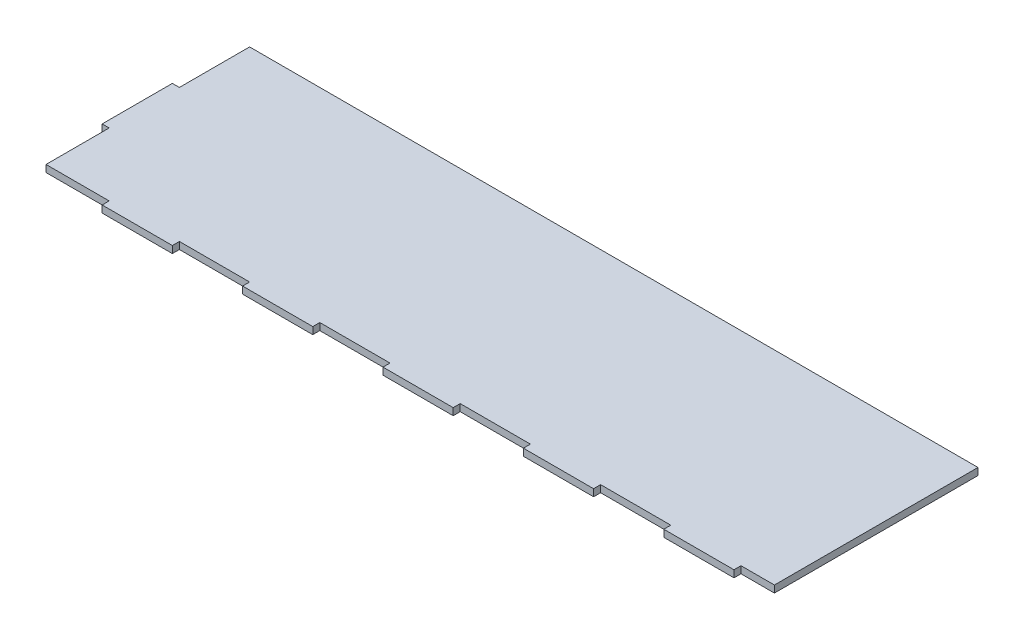
ISO-10303-21;
HEADER;
FILE_DESCRIPTION(('STEP AP214'),'2;1');
FILE_NAME('part.step','',(''),(''),'','','');
FILE_SCHEMA(('AUTOMOTIVE_DESIGN { 1 0 10303 214 1 1 1 1 }'));
ENDSEC;
DATA;
#1=APPLICATION_CONTEXT('core data for automotive mechanical design processes');
#2=APPLICATION_PROTOCOL_DEFINITION('international standard','automotive_design',2000,#1);
#3=PRODUCT_CONTEXT('',#1,'mechanical');
#4=PRODUCT('Part','Part','',(#3));
#5=PRODUCT_RELATED_PRODUCT_CATEGORY('part','',(#4));
#6=PRODUCT_DEFINITION_FORMATION('','',#4);
#7=PRODUCT_DEFINITION_CONTEXT('part definition',#1,'design');
#8=PRODUCT_DEFINITION('design','',#6,#7);
#9=PRODUCT_DEFINITION_SHAPE('','',#8);
#10=(LENGTH_UNIT() NAMED_UNIT(*) SI_UNIT(.MILLI.,.METRE.));
#11=(NAMED_UNIT(*) PLANE_ANGLE_UNIT() SI_UNIT($,.RADIAN.));
#12=(NAMED_UNIT(*) SI_UNIT($,.STERADIAN.) SOLID_ANGLE_UNIT());
#13=UNCERTAINTY_MEASURE_WITH_UNIT(LENGTH_MEASURE(1.E-05),#10,'distance_accuracy_value','');
#14=(GEOMETRIC_REPRESENTATION_CONTEXT(3) GLOBAL_UNCERTAINTY_ASSIGNED_CONTEXT((#13)) GLOBAL_UNIT_ASSIGNED_CONTEXT((#10,
#11,#12)) REPRESENTATION_CONTEXT('',''));
#15=CARTESIAN_POINT('',(0.,0.,0.));
#16=DIRECTION('',(0.,0.,1.));
#17=DIRECTION('',(1.,0.,0.));
#18=AXIS2_PLACEMENT_3D('',#15,#16,#17);
#19=CARTESIAN_POINT('',(-0.725000000000031,0.,0.));
#20=DIRECTION('',(1.,0.,0.));
#21=DIRECTION('',(0.,0.,-1.));
#22=AXIS2_PLACEMENT_3D('',#19,#20,#21);
#23=PLANE('',#22);
#24=DIRECTION('',(0.,0.,1.));
#25=VECTOR('',#24,1.);
#26=CARTESIAN_POINT('',(-0.725000000000031,0.,0.));
#27=LINE('',#26,#25);
#28=CARTESIAN_POINT('',(-0.725000000000031,0.,-45.));
#29=VERTEX_POINT('',#28);
#30=CARTESIAN_POINT('',(-0.725000000000031,0.,42.));
#31=VERTEX_POINT('',#30);
#32=EDGE_CURVE('E241',#29,#31,#27,.T.);
#33=ORIENTED_EDGE('',*,*,#32,.F.);
#34=DIRECTION('',(0.,1.,0.));
#35=VECTOR('',#34,1.);
#36=CARTESIAN_POINT('',(-0.725000000000031,3.,-45.));
#37=LINE('',#36,#35);
#38=CARTESIAN_POINT('',(-0.725000000000031,3.,-45.));
#39=VERTEX_POINT('',#38);
#40=EDGE_CURVE('E65',#29,#39,#37,.T.);
#41=ORIENTED_EDGE('',*,*,#40,.T.);
#42=DIRECTION('',(0.,0.,1.));
#43=VECTOR('',#42,1.);
#44=CARTESIAN_POINT('',(-0.725000000000031,3.,0.));
#45=LINE('',#44,#43);
#46=CARTESIAN_POINT('',(-0.725000000000031,3.,42.));
#47=VERTEX_POINT('',#46);
#48=EDGE_CURVE('E58',#39,#47,#45,.T.);
#49=ORIENTED_EDGE('',*,*,#48,.T.);
#50=DIRECTION('',(0.,-1.,0.));
#51=VECTOR('',#50,1.);
#52=CARTESIAN_POINT('',(-0.725000000000031,0.,42.));
#53=LINE('',#52,#51);
#54=EDGE_CURVE('E12',#47,#31,#53,.T.);
#55=ORIENTED_EDGE('',*,*,#54,.T.);
#56=EDGE_LOOP('',(#33,#41,#49,#55));
#57=FACE_BOUND('',#56,.T.);
#58=ADVANCED_FACE('F42',(#57),#23,.T.);
#59=CARTESIAN_POINT('',(-315.,3.,-45.));
#60=DIRECTION('',(0.,0.,1.));
#61=DIRECTION('',(1.,0.,0.));
#62=AXIS2_PLACEMENT_3D('',#59,#60,#61);
#63=PLANE('',#62);
#64=ORIENTED_EDGE('',*,*,#40,.F.);
#65=DIRECTION('',(-1.,0.,0.));
#66=VECTOR('',#65,1.);
#67=CARTESIAN_POINT('',(-315.,0.,-45.));
#68=LINE('',#67,#66);
#69=CARTESIAN_POINT('',(-312.,0.,-45.));
#70=VERTEX_POINT('',#69);
#71=EDGE_CURVE('E244',#29,#70,#68,.T.);
#72=ORIENTED_EDGE('',*,*,#71,.T.);
#73=DIRECTION('',(0.,1.,0.));
#74=VECTOR('',#73,1.);
#75=CARTESIAN_POINT('',(-312.,0.,-45.));
#76=LINE('',#75,#74);
#77=CARTESIAN_POINT('',(-312.,3.,-45.));
#78=VERTEX_POINT('',#77);
#79=EDGE_CURVE('E286',#70,#78,#76,.T.);
#80=ORIENTED_EDGE('',*,*,#79,.T.);
#81=DIRECTION('',(-1.,0.,0.));
#82=VECTOR('',#81,1.);
#83=CARTESIAN_POINT('',(-315.,3.,-45.));
#84=LINE('',#83,#82);
#85=EDGE_CURVE('E475',#39,#78,#84,.T.);
#86=ORIENTED_EDGE('',*,*,#85,.F.);
#87=EDGE_LOOP('',(#64,#72,#80,#86));
#88=FACE_BOUND('',#87,.T.);
#89=ADVANCED_FACE('F44',(#88),#63,.F.);
#90=CARTESIAN_POINT('',(0.,3.,0.));
#91=DIRECTION('',(0.,-1.,0.));
#92=DIRECTION('',(0.,0.,-1.));
#93=AXIS2_PLACEMENT_3D('',#90,#91,#92);
#94=PLANE('',#93);
#95=ORIENTED_EDGE('',*,*,#48,.F.);
#96=ORIENTED_EDGE('',*,*,#85,.T.);
#97=DIRECTION('',(0.,0.,-1.));
#98=VECTOR('',#97,1.);
#99=CARTESIAN_POINT('',(-312.,3.,-45.));
#100=LINE('',#99,#98);
#101=CARTESIAN_POINT('',(-312.,3.,-15.));
#102=VERTEX_POINT('',#101);
#103=EDGE_CURVE('E276',#102,#78,#100,.T.);
#104=ORIENTED_EDGE('',*,*,#103,.F.);
#105=DIRECTION('',(1.,0.,0.));
#106=VECTOR('',#105,1.);
#107=CARTESIAN_POINT('',(-315.,3.,-15.));
#108=LINE('',#107,#106);
#109=CARTESIAN_POINT('',(-315.,3.,-15.));
#110=VERTEX_POINT('',#109);
#111=EDGE_CURVE('E270',#110,#102,#108,.T.);
#112=ORIENTED_EDGE('',*,*,#111,.F.);
#113=DIRECTION('',(0.,0.,1.));
#114=VECTOR('',#113,1.);
#115=CARTESIAN_POINT('',(-315.,3.,45.));
#116=LINE('',#115,#114);
#117=CARTESIAN_POINT('',(-315.,3.,15.));
#118=VERTEX_POINT('',#117);
#119=EDGE_CURVE('E478',#110,#118,#116,.T.);
#120=ORIENTED_EDGE('',*,*,#119,.T.);
#121=DIRECTION('',(-1.,0.,0.));
#122=VECTOR('',#121,1.);
#123=CARTESIAN_POINT('',(-315.,3.,15.));
#124=LINE('',#123,#122);
#125=CARTESIAN_POINT('',(-312.,3.,15.));
#126=VERTEX_POINT('',#125);
#127=EDGE_CURVE('E257',#126,#118,#124,.T.);
#128=ORIENTED_EDGE('',*,*,#127,.F.);
#129=DIRECTION('',(0.,0.,-1.));
#130=VECTOR('',#129,1.);
#131=CARTESIAN_POINT('',(-312.,3.,42.));
#132=LINE('',#131,#130);
#133=CARTESIAN_POINT('',(-312.,3.,42.));
#134=VERTEX_POINT('',#133);
#135=EDGE_CURVE('E251',#134,#126,#132,.T.);
#136=ORIENTED_EDGE('',*,*,#135,.F.);
#137=DIRECTION('',(-1.,0.,0.));
#138=VECTOR('',#137,1.);
#139=CARTESIAN_POINT('',(-315.,3.,42.));
#140=LINE('',#139,#138);
#141=CARTESIAN_POINT('',(-285.,3.,42.));
#142=VERTEX_POINT('',#141);
#143=EDGE_CURVE('E388',#142,#134,#140,.T.);
#144=ORIENTED_EDGE('',*,*,#143,.F.);
#145=DIRECTION('',(0.,0.,-1.));
#146=VECTOR('',#145,1.);
#147=CARTESIAN_POINT('',(-285.,3.,45.));
#148=LINE('',#147,#146);
#149=CARTESIAN_POINT('',(-285.,3.,45.));
#150=VERTEX_POINT('',#149);
#151=EDGE_CURVE('E290',#150,#142,#148,.T.);
#152=ORIENTED_EDGE('',*,*,#151,.F.);
#153=DIRECTION('',(1.,0.,0.));
#154=VECTOR('',#153,1.);
#155=CARTESIAN_POINT('',(-315.,3.,45.));
#156=LINE('',#155,#154);
#157=CARTESIAN_POINT('',(-255.,3.,45.));
#158=VERTEX_POINT('',#157);
#159=EDGE_CURVE('E504',#150,#158,#156,.T.);
#160=ORIENTED_EDGE('',*,*,#159,.T.);
#161=DIRECTION('',(0.,0.,1.));
#162=VECTOR('',#161,1.);
#163=CARTESIAN_POINT('',(-255.,3.,45.));
#164=LINE('',#163,#162);
#165=CARTESIAN_POINT('',(-255.,3.,42.));
#166=VERTEX_POINT('',#165);
#167=EDGE_CURVE('E429',#166,#158,#164,.T.);
#168=ORIENTED_EDGE('',*,*,#167,.F.);
#169=DIRECTION('',(-1.,0.,0.));
#170=VECTOR('',#169,1.);
#171=CARTESIAN_POINT('',(-255.,3.,42.));
#172=LINE('',#171,#170);
#173=CARTESIAN_POINT('',(-225.,3.,42.));
#174=VERTEX_POINT('',#173);
#175=EDGE_CURVE('E444',#174,#166,#172,.T.);
#176=ORIENTED_EDGE('',*,*,#175,.F.);
#177=DIRECTION('',(0.,0.,-1.));
#178=VECTOR('',#177,1.);
#179=CARTESIAN_POINT('',(-225.,3.,45.));
#180=LINE('',#179,#178);
#181=CARTESIAN_POINT('',(-225.,3.,45.));
#182=VERTEX_POINT('',#181);
#183=EDGE_CURVE('E456',#182,#174,#180,.T.);
#184=ORIENTED_EDGE('',*,*,#183,.F.);
#185=CARTESIAN_POINT('',(-195.,3.,45.));
#186=VERTEX_POINT('',#185);
#187=EDGE_CURVE('E488',#182,#186,#156,.T.);
#188=ORIENTED_EDGE('',*,*,#187,.T.);
#189=DIRECTION('',(0.,0.,1.));
#190=VECTOR('',#189,1.);
#191=CARTESIAN_POINT('',(-195.,3.,45.));
#192=LINE('',#191,#190);
#193=CARTESIAN_POINT('',(-195.,3.,42.));
#194=VERTEX_POINT('',#193);
#195=EDGE_CURVE('E324',#194,#186,#192,.T.);
#196=ORIENTED_EDGE('',*,*,#195,.F.);
#197=DIRECTION('',(-1.,0.,0.));
#198=VECTOR('',#197,1.);
#199=CARTESIAN_POINT('',(-195.,3.,42.));
#200=LINE('',#199,#198);
#201=CARTESIAN_POINT('',(-165.,3.,42.));
#202=VERTEX_POINT('',#201);
#203=EDGE_CURVE('E408',#202,#194,#200,.T.);
#204=ORIENTED_EDGE('',*,*,#203,.F.);
#205=DIRECTION('',(0.,0.,-1.));
#206=VECTOR('',#205,1.);
#207=CARTESIAN_POINT('',(-165.,3.,45.));
#208=LINE('',#207,#206);
#209=CARTESIAN_POINT('',(-165.,3.,45.));
#210=VERTEX_POINT('',#209);
#211=EDGE_CURVE('E419',#210,#202,#208,.T.);
#212=ORIENTED_EDGE('',*,*,#211,.F.);
#213=CARTESIAN_POINT('',(-135.,3.,45.));
#214=VERTEX_POINT('',#213);
#215=EDGE_CURVE('E636',#210,#214,#156,.T.);
#216=ORIENTED_EDGE('',*,*,#215,.T.);
#217=DIRECTION('',(0.,0.,1.));
#218=VECTOR('',#217,1.);
#219=CARTESIAN_POINT('',(-135.,3.,45.));
#220=LINE('',#219,#218);
#221=CARTESIAN_POINT('',(-135.,3.,42.));
#222=VERTEX_POINT('',#221);
#223=EDGE_CURVE('E310',#222,#214,#220,.T.);
#224=ORIENTED_EDGE('',*,*,#223,.F.);
#225=DIRECTION('',(-1.,0.,0.));
#226=VECTOR('',#225,1.);
#227=CARTESIAN_POINT('',(-135.,3.,42.));
#228=LINE('',#227,#226);
#229=CARTESIAN_POINT('',(-105.,3.,42.));
#230=VERTEX_POINT('',#229);
#231=EDGE_CURVE('E301',#230,#222,#228,.T.);
#232=ORIENTED_EDGE('',*,*,#231,.F.);
#233=DIRECTION('',(0.,0.,-1.));
#234=VECTOR('',#233,1.);
#235=CARTESIAN_POINT('',(-105.,3.,45.));
#236=LINE('',#235,#234);
#237=CARTESIAN_POINT('',(-105.,3.,45.));
#238=VERTEX_POINT('',#237);
#239=EDGE_CURVE('E313',#238,#230,#236,.T.);
#240=ORIENTED_EDGE('',*,*,#239,.F.);
#241=CARTESIAN_POINT('',(-75.,3.,45.));
#242=VERTEX_POINT('',#241);
#243=EDGE_CURVE('E487',#238,#242,#156,.T.);
#244=ORIENTED_EDGE('',*,*,#243,.T.);
#245=DIRECTION('',(0.,0.,1.));
#246=VECTOR('',#245,1.);
#247=CARTESIAN_POINT('',(-75.,3.,45.));
#248=LINE('',#247,#246);
#249=CARTESIAN_POINT('',(-75.,3.,42.));
#250=VERTEX_POINT('',#249);
#251=EDGE_CURVE('E348',#250,#242,#248,.T.);
#252=ORIENTED_EDGE('',*,*,#251,.F.);
#253=DIRECTION('',(-1.,0.,0.));
#254=VECTOR('',#253,1.);
#255=CARTESIAN_POINT('',(-75.,3.,42.));
#256=LINE('',#255,#254);
#257=CARTESIAN_POINT('',(-45.,3.,42.));
#258=VERTEX_POINT('',#257);
#259=EDGE_CURVE('E339',#258,#250,#256,.T.);
#260=ORIENTED_EDGE('',*,*,#259,.F.);
#261=DIRECTION('',(0.,0.,-1.));
#262=VECTOR('',#261,1.);
#263=CARTESIAN_POINT('',(-45.,3.,45.));
#264=LINE('',#263,#262);
#265=CARTESIAN_POINT('',(-45.,3.,45.));
#266=VERTEX_POINT('',#265);
#267=EDGE_CURVE('E351',#266,#258,#264,.T.);
#268=ORIENTED_EDGE('',*,*,#267,.F.);
#269=CARTESIAN_POINT('',(-15.,3.,45.));
#270=VERTEX_POINT('',#269);
#271=EDGE_CURVE('E483',#266,#270,#156,.T.);
#272=ORIENTED_EDGE('',*,*,#271,.T.);
#273=DIRECTION('',(0.,0.,1.));
#274=VECTOR('',#273,1.);
#275=CARTESIAN_POINT('',(-15.,3.,45.));
#276=LINE('',#275,#274);
#277=CARTESIAN_POINT('',(-15.,3.,42.));
#278=VERTEX_POINT('',#277);
#279=EDGE_CURVE('E372',#278,#270,#276,.T.);
#280=ORIENTED_EDGE('',*,*,#279,.F.);
#281=DIRECTION('',(-1.,0.,0.));
#282=VECTOR('',#281,1.);
#283=CARTESIAN_POINT('',(-15.,3.,42.));
#284=LINE('',#283,#282);
#285=EDGE_CURVE('E370',#47,#278,#284,.T.);
#286=ORIENTED_EDGE('',*,*,#285,.F.);
#287=EDGE_LOOP('',(#95,#96,#104,#112,#120,#128,#136,#144,#152,#160,#168,#176,#184,#188,#196,
#204,#212,#216,#224,#232,#240,#244,#252,#260,#268,#272,#280,#286));
#288=FACE_BOUND('',#287,.T.);
#289=ADVANCED_FACE('F526',(#288),#94,.F.);
#290=CARTESIAN_POINT('',(0.,0.,0.));
#291=DIRECTION('',(0.,-1.,0.));
#292=DIRECTION('',(0.,0.,-1.));
#293=AXIS2_PLACEMENT_3D('',#290,#291,#292);
#294=PLANE('',#293);
#295=ORIENTED_EDGE('',*,*,#71,.F.);
#296=ORIENTED_EDGE('',*,*,#32,.T.);
#297=DIRECTION('',(-1.,0.,0.));
#298=VECTOR('',#297,1.);
#299=CARTESIAN_POINT('',(-15.,0.,42.));
#300=LINE('',#299,#298);
#301=CARTESIAN_POINT('',(-15.,0.,42.));
#302=VERTEX_POINT('',#301);
#303=EDGE_CURVE('E228',#31,#302,#300,.T.);
#304=ORIENTED_EDGE('',*,*,#303,.T.);
#305=DIRECTION('',(0.,0.,1.));
#306=VECTOR('',#305,1.);
#307=CARTESIAN_POINT('',(-15.,0.,45.));
#308=LINE('',#307,#306);
#309=CARTESIAN_POINT('',(-15.,0.,45.));
#310=VERTEX_POINT('',#309);
#311=EDGE_CURVE('E238',#302,#310,#308,.T.);
#312=ORIENTED_EDGE('',*,*,#311,.T.);
#313=DIRECTION('',(1.,0.,0.));
#314=VECTOR('',#313,1.);
#315=CARTESIAN_POINT('',(-315.,0.,45.));
#316=LINE('',#315,#314);
#317=CARTESIAN_POINT('',(-45.,0.,45.));
#318=VERTEX_POINT('',#317);
#319=EDGE_CURVE('E495',#318,#310,#316,.T.);
#320=ORIENTED_EDGE('',*,*,#319,.F.);
#321=DIRECTION('',(0.,0.,-1.));
#322=VECTOR('',#321,1.);
#323=CARTESIAN_POINT('',(-45.,0.,45.));
#324=LINE('',#323,#322);
#325=CARTESIAN_POINT('',(-45.,0.,42.));
#326=VERTEX_POINT('',#325);
#327=EDGE_CURVE('E338',#318,#326,#324,.T.);
#328=ORIENTED_EDGE('',*,*,#327,.T.);
#329=DIRECTION('',(-1.,0.,0.));
#330=VECTOR('',#329,1.);
#331=CARTESIAN_POINT('',(-75.,0.,42.));
#332=LINE('',#331,#330);
#333=CARTESIAN_POINT('',(-75.,0.,42.));
#334=VERTEX_POINT('',#333);
#335=EDGE_CURVE('E343',#326,#334,#332,.T.);
#336=ORIENTED_EDGE('',*,*,#335,.T.);
#337=DIRECTION('',(0.,0.,1.));
#338=VECTOR('',#337,1.);
#339=CARTESIAN_POINT('',(-75.,0.,45.));
#340=LINE('',#339,#338);
#341=CARTESIAN_POINT('',(-75.,0.,45.));
#342=VERTEX_POINT('',#341);
#343=EDGE_CURVE('E334',#334,#342,#340,.T.);
#344=ORIENTED_EDGE('',*,*,#343,.T.);
#345=CARTESIAN_POINT('',(-105.,0.,45.));
#346=VERTEX_POINT('',#345);
#347=EDGE_CURVE('E499',#346,#342,#316,.T.);
#348=ORIENTED_EDGE('',*,*,#347,.F.);
#349=DIRECTION('',(0.,0.,-1.));
#350=VECTOR('',#349,1.);
#351=CARTESIAN_POINT('',(-105.,0.,45.));
#352=LINE('',#351,#350);
#353=CARTESIAN_POINT('',(-105.,0.,42.));
#354=VERTEX_POINT('',#353);
#355=EDGE_CURVE('E300',#346,#354,#352,.T.);
#356=ORIENTED_EDGE('',*,*,#355,.T.);
#357=DIRECTION('',(-1.,0.,0.));
#358=VECTOR('',#357,1.);
#359=CARTESIAN_POINT('',(-135.,0.,42.));
#360=LINE('',#359,#358);
#361=CARTESIAN_POINT('',(-135.,0.,42.));
#362=VERTEX_POINT('',#361);
#363=EDGE_CURVE('E305',#354,#362,#360,.T.);
#364=ORIENTED_EDGE('',*,*,#363,.T.);
#365=DIRECTION('',(0.,0.,1.));
#366=VECTOR('',#365,1.);
#367=CARTESIAN_POINT('',(-135.,0.,45.));
#368=LINE('',#367,#366);
#369=CARTESIAN_POINT('',(-135.,0.,45.));
#370=VERTEX_POINT('',#369);
#371=EDGE_CURVE('E296',#362,#370,#368,.T.);
#372=ORIENTED_EDGE('',*,*,#371,.T.);
#373=CARTESIAN_POINT('',(-165.,0.,45.));
#374=VERTEX_POINT('',#373);
#375=EDGE_CURVE('E663',#374,#370,#316,.T.);
#376=ORIENTED_EDGE('',*,*,#375,.F.);
#377=DIRECTION('',(0.,0.,-1.));
#378=VECTOR('',#377,1.);
#379=CARTESIAN_POINT('',(-165.,0.,45.));
#380=LINE('',#379,#378);
#381=CARTESIAN_POINT('',(-165.,0.,42.));
#382=VERTEX_POINT('',#381);
#383=EDGE_CURVE('E407',#374,#382,#380,.T.);
#384=ORIENTED_EDGE('',*,*,#383,.T.);
#385=DIRECTION('',(-1.,0.,0.));
#386=VECTOR('',#385,1.);
#387=CARTESIAN_POINT('',(-195.,0.,42.));
#388=LINE('',#387,#386);
#389=CARTESIAN_POINT('',(-195.,0.,42.));
#390=VERTEX_POINT('',#389);
#391=EDGE_CURVE('E412',#382,#390,#388,.T.);
#392=ORIENTED_EDGE('',*,*,#391,.T.);
#393=DIRECTION('',(0.,0.,1.));
#394=VECTOR('',#393,1.);
#395=CARTESIAN_POINT('',(-195.,0.,45.));
#396=LINE('',#395,#394);
#397=CARTESIAN_POINT('',(-195.,0.,45.));
#398=VERTEX_POINT('',#397);
#399=EDGE_CURVE('E403',#390,#398,#396,.T.);
#400=ORIENTED_EDGE('',*,*,#399,.T.);
#401=CARTESIAN_POINT('',(-225.,0.,45.));
#402=VERTEX_POINT('',#401);
#403=EDGE_CURVE('E500',#402,#398,#316,.T.);
#404=ORIENTED_EDGE('',*,*,#403,.F.);
#405=DIRECTION('',(0.,0.,-1.));
#406=VECTOR('',#405,1.);
#407=CARTESIAN_POINT('',(-225.,0.,45.));
#408=LINE('',#407,#406);
#409=CARTESIAN_POINT('',(-225.,0.,42.));
#410=VERTEX_POINT('',#409);
#411=EDGE_CURVE('E443',#402,#410,#408,.T.);
#412=ORIENTED_EDGE('',*,*,#411,.T.);
#413=DIRECTION('',(-1.,0.,0.));
#414=VECTOR('',#413,1.);
#415=CARTESIAN_POINT('',(-255.,0.,42.));
#416=LINE('',#415,#414);
#417=CARTESIAN_POINT('',(-255.,0.,42.));
#418=VERTEX_POINT('',#417);
#419=EDGE_CURVE('E448',#410,#418,#416,.T.);
#420=ORIENTED_EDGE('',*,*,#419,.T.);
#421=DIRECTION('',(0.,0.,1.));
#422=VECTOR('',#421,1.);
#423=CARTESIAN_POINT('',(-255.,0.,45.));
#424=LINE('',#423,#422);
#425=CARTESIAN_POINT('',(-255.,0.,45.));
#426=VERTEX_POINT('',#425);
#427=EDGE_CURVE('E439',#418,#426,#424,.T.);
#428=ORIENTED_EDGE('',*,*,#427,.T.);
#429=CARTESIAN_POINT('',(-285.,0.,45.));
#430=VERTEX_POINT('',#429);
#431=EDGE_CURVE('E479',#430,#426,#316,.T.);
#432=ORIENTED_EDGE('',*,*,#431,.F.);
#433=DIRECTION('',(0.,0.,-1.));
#434=VECTOR('',#433,1.);
#435=CARTESIAN_POINT('',(-285.,0.,45.));
#436=LINE('',#435,#434);
#437=CARTESIAN_POINT('',(-285.,0.,42.));
#438=VERTEX_POINT('',#437);
#439=EDGE_CURVE('E383',#430,#438,#436,.T.);
#440=ORIENTED_EDGE('',*,*,#439,.T.);
#441=DIRECTION('',(-1.,0.,0.));
#442=VECTOR('',#441,1.);
#443=CARTESIAN_POINT('',(-315.,0.,42.));
#444=LINE('',#443,#442);
#445=CARTESIAN_POINT('',(-312.,0.,42.));
#446=VERTEX_POINT('',#445);
#447=EDGE_CURVE('E387',#438,#446,#444,.T.);
#448=ORIENTED_EDGE('',*,*,#447,.T.);
#449=DIRECTION('',(0.,0.,1.));
#450=VECTOR('',#449,1.);
#451=CARTESIAN_POINT('',(-312.,0.,0.));
#452=LINE('',#451,#450);
#453=CARTESIAN_POINT('',(-312.,0.,15.));
#454=VERTEX_POINT('',#453);
#455=EDGE_CURVE('E265',#454,#446,#452,.T.);
#456=ORIENTED_EDGE('',*,*,#455,.F.);
#457=DIRECTION('',(1.,0.,0.));
#458=VECTOR('',#457,1.);
#459=CARTESIAN_POINT('',(0.,0.,15.));
#460=LINE('',#459,#458);
#461=CARTESIAN_POINT('',(-315.,0.,15.));
#462=VERTEX_POINT('',#461);
#463=EDGE_CURVE('E51',#462,#454,#460,.T.);
#464=ORIENTED_EDGE('',*,*,#463,.F.);
#465=DIRECTION('',(0.,0.,1.));
#466=VECTOR('',#465,1.);
#467=CARTESIAN_POINT('',(-315.,0.,45.));
#468=LINE('',#467,#466);
#469=CARTESIAN_POINT('',(-315.,0.,-15.));
#470=VERTEX_POINT('',#469);
#471=EDGE_CURVE('E491',#470,#462,#468,.T.);
#472=ORIENTED_EDGE('',*,*,#471,.F.);
#473=DIRECTION('',(1.,0.,0.));
#474=VECTOR('',#473,1.);
#475=CARTESIAN_POINT('',(-315.,0.,-15.));
#476=LINE('',#475,#474);
#477=CARTESIAN_POINT('',(-312.,0.,-15.));
#478=VERTEX_POINT('',#477);
#479=EDGE_CURVE('E271',#470,#478,#476,.T.);
#480=ORIENTED_EDGE('',*,*,#479,.T.);
#481=DIRECTION('',(0.,0.,-1.));
#482=VECTOR('',#481,1.);
#483=CARTESIAN_POINT('',(-312.,0.,-45.));
#484=LINE('',#483,#482);
#485=EDGE_CURVE('E275',#478,#70,#484,.T.);
#486=ORIENTED_EDGE('',*,*,#485,.T.);
#487=EDGE_LOOP('',(#295,#296,#304,#312,#320,#328,#336,#344,#348,#356,#364,#372,#376,#384,#392,
#400,#404,#412,#420,#428,#432,#440,#448,#456,#464,#472,#480,#486));
#488=FACE_BOUND('',#487,.T.);
#489=ADVANCED_FACE('F242',(#488),#294,.T.);
#490=CARTESIAN_POINT('',(-15.,0.,42.));
#491=DIRECTION('',(0.,0.,-1.));
#492=DIRECTION('',(-1.,0.,0.));
#493=AXIS2_PLACEMENT_3D('',#490,#491,#492);
#494=PLANE('',#493);
#495=ORIENTED_EDGE('',*,*,#54,.F.);
#496=ORIENTED_EDGE('',*,*,#285,.T.);
#497=DIRECTION('',(0.,1.,0.));
#498=VECTOR('',#497,1.);
#499=CARTESIAN_POINT('',(-15.,0.,42.));
#500=LINE('',#499,#498);
#501=EDGE_CURVE('E232',#302,#278,#500,.T.);
#502=ORIENTED_EDGE('',*,*,#501,.F.);
#503=ORIENTED_EDGE('',*,*,#303,.F.);
#504=EDGE_LOOP('',(#495,#496,#502,#503));
#505=FACE_BOUND('',#504,.T.);
#506=ADVANCED_FACE('F230',(#505),#494,.F.);
#507=CARTESIAN_POINT('',(-315.,3.,45.));
#508=DIRECTION('',(0.,0.,-1.));
#509=DIRECTION('',(-1.,0.,0.));
#510=AXIS2_PLACEMENT_3D('',#507,#508,#509);
#511=PLANE('',#510);
#512=ORIENTED_EDGE('',*,*,#319,.T.);
#513=DIRECTION('',(0.,1.,0.));
#514=VECTOR('',#513,1.);
#515=CARTESIAN_POINT('',(-15.,0.,45.));
#516=LINE('',#515,#514);
#517=EDGE_CURVE('E237',#310,#270,#516,.T.);
#518=ORIENTED_EDGE('',*,*,#517,.T.);
#519=ORIENTED_EDGE('',*,*,#271,.F.);
#520=DIRECTION('',(0.,1.,0.));
#521=VECTOR('',#520,1.);
#522=CARTESIAN_POINT('',(-45.,0.,45.));
#523=LINE('',#522,#521);
#524=EDGE_CURVE('E363',#318,#266,#523,.T.);
#525=ORIENTED_EDGE('',*,*,#524,.F.);
#526=EDGE_LOOP('',(#512,#518,#519,#525));
#527=FACE_BOUND('',#526,.T.);
#528=ADVANCED_FACE('F585',(#527),#511,.F.);
#529=ORIENTED_EDGE('',*,*,#347,.T.);
#530=DIRECTION('',(0.,1.,0.));
#531=VECTOR('',#530,1.);
#532=CARTESIAN_POINT('',(-75.,0.,45.));
#533=LINE('',#532,#531);
#534=EDGE_CURVE('E347',#342,#242,#533,.T.);
#535=ORIENTED_EDGE('',*,*,#534,.T.);
#536=ORIENTED_EDGE('',*,*,#243,.F.);
#537=DIRECTION('',(0.,1.,0.));
#538=VECTOR('',#537,1.);
#539=CARTESIAN_POINT('',(-105.,0.,45.));
#540=LINE('',#539,#538);
#541=EDGE_CURVE('E328',#346,#238,#540,.T.);
#542=ORIENTED_EDGE('',*,*,#541,.F.);
#543=EDGE_LOOP('',(#529,#535,#536,#542));
#544=FACE_BOUND('',#543,.T.);
#545=ADVANCED_FACE('F619',(#544),#511,.F.);
#546=ORIENTED_EDGE('',*,*,#375,.T.);
#547=DIRECTION('',(0.,1.,0.));
#548=VECTOR('',#547,1.);
#549=CARTESIAN_POINT('',(-135.,0.,45.));
#550=LINE('',#549,#548);
#551=EDGE_CURVE('E309',#370,#214,#550,.T.);
#552=ORIENTED_EDGE('',*,*,#551,.T.);
#553=ORIENTED_EDGE('',*,*,#215,.F.);
#554=DIRECTION('',(0.,1.,0.));
#555=VECTOR('',#554,1.);
#556=CARTESIAN_POINT('',(-165.,0.,45.));
#557=LINE('',#556,#555);
#558=EDGE_CURVE('E433',#374,#210,#557,.T.);
#559=ORIENTED_EDGE('',*,*,#558,.F.);
#560=EDGE_LOOP('',(#546,#552,#553,#559));
#561=FACE_BOUND('',#560,.T.);
#562=ADVANCED_FACE('F631',(#561),#511,.F.);
#563=ORIENTED_EDGE('',*,*,#403,.T.);
#564=DIRECTION('',(0.,1.,0.));
#565=VECTOR('',#564,1.);
#566=CARTESIAN_POINT('',(-195.,0.,45.));
#567=LINE('',#566,#565);
#568=EDGE_CURVE('E416',#398,#186,#567,.T.);
#569=ORIENTED_EDGE('',*,*,#568,.T.);
#570=ORIENTED_EDGE('',*,*,#187,.F.);
#571=DIRECTION('',(0.,1.,0.));
#572=VECTOR('',#571,1.);
#573=CARTESIAN_POINT('',(-225.,0.,45.));
#574=LINE('',#573,#572);
#575=EDGE_CURVE('E469',#402,#182,#574,.T.);
#576=ORIENTED_EDGE('',*,*,#575,.F.);
#577=EDGE_LOOP('',(#563,#569,#570,#576));
#578=FACE_BOUND('',#577,.T.);
#579=ADVANCED_FACE('F626',(#578),#511,.F.);
#580=ORIENTED_EDGE('',*,*,#159,.F.);
#581=DIRECTION('',(0.,1.,0.));
#582=VECTOR('',#581,1.);
#583=CARTESIAN_POINT('',(-285.,0.,45.));
#584=LINE('',#583,#582);
#585=EDGE_CURVE('E392',#430,#150,#584,.T.);
#586=ORIENTED_EDGE('',*,*,#585,.F.);
#587=ORIENTED_EDGE('',*,*,#431,.T.);
#588=DIRECTION('',(0.,1.,0.));
#589=VECTOR('',#588,1.);
#590=CARTESIAN_POINT('',(-255.,0.,45.));
#591=LINE('',#590,#589);
#592=EDGE_CURVE('E452',#426,#158,#591,.T.);
#593=ORIENTED_EDGE('',*,*,#592,.T.);
#594=EDGE_LOOP('',(#580,#586,#587,#593));
#595=FACE_BOUND('',#594,.T.);
#596=ADVANCED_FACE('F621',(#595),#511,.F.);
#597=CARTESIAN_POINT('',(-315.,3.,45.));
#598=DIRECTION('',(1.,0.,0.));
#599=DIRECTION('',(0.,0.,-1.));
#600=AXIS2_PLACEMENT_3D('',#597,#598,#599);
#601=PLANE('',#600);
#602=ORIENTED_EDGE('',*,*,#471,.T.);
#603=DIRECTION('',(0.,1.,0.));
#604=VECTOR('',#603,1.);
#605=CARTESIAN_POINT('',(-315.,-7.,15.));
#606=LINE('',#605,#604);
#607=EDGE_CURVE('E261',#462,#118,#606,.T.);
#608=ORIENTED_EDGE('',*,*,#607,.T.);
#609=ORIENTED_EDGE('',*,*,#119,.F.);
#610=DIRECTION('',(0.,1.,0.));
#611=VECTOR('',#610,1.);
#612=CARTESIAN_POINT('',(-315.,0.,-15.));
#613=LINE('',#612,#611);
#614=EDGE_CURVE('E279',#470,#110,#613,.T.);
#615=ORIENTED_EDGE('',*,*,#614,.F.);
#616=EDGE_LOOP('',(#602,#608,#609,#615));
#617=FACE_BOUND('',#616,.T.);
#618=ADVANCED_FACE('F530',(#617),#601,.F.);
#619=CARTESIAN_POINT('',(-255.,0.,45.));
#620=DIRECTION('',(-1.,0.,0.));
#621=DIRECTION('',(0.,0.,1.));
#622=AXIS2_PLACEMENT_3D('',#619,#620,#621);
#623=PLANE('',#622);
#624=ORIENTED_EDGE('',*,*,#167,.T.);
#625=ORIENTED_EDGE('',*,*,#592,.F.);
#626=ORIENTED_EDGE('',*,*,#427,.F.);
#627=DIRECTION('',(0.,1.,0.));
#628=VECTOR('',#627,1.);
#629=CARTESIAN_POINT('',(-255.,0.,42.));
#630=LINE('',#629,#628);
#631=EDGE_CURVE('E463',#418,#166,#630,.T.);
#632=ORIENTED_EDGE('',*,*,#631,.T.);
#633=EDGE_LOOP('',(#624,#625,#626,#632));
#634=FACE_BOUND('',#633,.T.);
#635=ADVANCED_FACE('F608',(#634),#623,.F.);
#636=CARTESIAN_POINT('',(-255.,0.,42.));
#637=DIRECTION('',(0.,0.,-1.));
#638=DIRECTION('',(-1.,0.,0.));
#639=AXIS2_PLACEMENT_3D('',#636,#637,#638);
#640=PLANE('',#639);
#641=ORIENTED_EDGE('',*,*,#175,.T.);
#642=ORIENTED_EDGE('',*,*,#631,.F.);
#643=ORIENTED_EDGE('',*,*,#419,.F.);
#644=DIRECTION('',(0.,1.,0.));
#645=VECTOR('',#644,1.);
#646=CARTESIAN_POINT('',(-225.,0.,42.));
#647=LINE('',#646,#645);
#648=EDGE_CURVE('E466',#410,#174,#647,.T.);
#649=ORIENTED_EDGE('',*,*,#648,.T.);
#650=EDGE_LOOP('',(#641,#642,#643,#649));
#651=FACE_BOUND('',#650,.T.);
#652=ADVANCED_FACE('F605',(#651),#640,.F.);
#653=CARTESIAN_POINT('',(-225.,0.,45.));
#654=DIRECTION('',(1.,0.,0.));
#655=DIRECTION('',(0.,0.,-1.));
#656=AXIS2_PLACEMENT_3D('',#653,#654,#655);
#657=PLANE('',#656);
#658=ORIENTED_EDGE('',*,*,#183,.T.);
#659=ORIENTED_EDGE('',*,*,#648,.F.);
#660=ORIENTED_EDGE('',*,*,#411,.F.);
#661=ORIENTED_EDGE('',*,*,#575,.T.);
#662=EDGE_LOOP('',(#658,#659,#660,#661));
#663=FACE_BOUND('',#662,.T.);
#664=ADVANCED_FACE('F603',(#663),#657,.F.);
#665=CARTESIAN_POINT('',(-195.,0.,45.));
#666=DIRECTION('',(-1.,0.,0.));
#667=DIRECTION('',(0.,0.,1.));
#668=AXIS2_PLACEMENT_3D('',#665,#666,#667);
#669=PLANE('',#668);
#670=ORIENTED_EDGE('',*,*,#195,.T.);
#671=ORIENTED_EDGE('',*,*,#568,.F.);
#672=ORIENTED_EDGE('',*,*,#399,.F.);
#673=DIRECTION('',(0.,1.,0.));
#674=VECTOR('',#673,1.);
#675=CARTESIAN_POINT('',(-195.,0.,42.));
#676=LINE('',#675,#674);
#677=EDGE_CURVE('E426',#390,#194,#676,.T.);
#678=ORIENTED_EDGE('',*,*,#677,.T.);
#679=EDGE_LOOP('',(#670,#671,#672,#678));
#680=FACE_BOUND('',#679,.T.);
#681=ADVANCED_FACE('F596',(#680),#669,.F.);
#682=CARTESIAN_POINT('',(-195.,0.,42.));
#683=DIRECTION('',(0.,0.,-1.));
#684=DIRECTION('',(-1.,0.,0.));
#685=AXIS2_PLACEMENT_3D('',#682,#683,#684);
#686=PLANE('',#685);
#687=ORIENTED_EDGE('',*,*,#203,.T.);
#688=ORIENTED_EDGE('',*,*,#677,.F.);
#689=ORIENTED_EDGE('',*,*,#391,.F.);
#690=DIRECTION('',(0.,1.,0.));
#691=VECTOR('',#690,1.);
#692=CARTESIAN_POINT('',(-165.,0.,42.));
#693=LINE('',#692,#691);
#694=EDGE_CURVE('E430',#382,#202,#693,.T.);
#695=ORIENTED_EDGE('',*,*,#694,.T.);
#696=EDGE_LOOP('',(#687,#688,#689,#695));
#697=FACE_BOUND('',#696,.T.);
#698=ADVANCED_FACE('F593',(#697),#686,.F.);
#699=CARTESIAN_POINT('',(-165.,0.,45.));
#700=DIRECTION('',(1.,0.,0.));
#701=DIRECTION('',(0.,0.,-1.));
#702=AXIS2_PLACEMENT_3D('',#699,#700,#701);
#703=PLANE('',#702);
#704=ORIENTED_EDGE('',*,*,#211,.T.);
#705=ORIENTED_EDGE('',*,*,#694,.F.);
#706=ORIENTED_EDGE('',*,*,#383,.F.);
#707=ORIENTED_EDGE('',*,*,#558,.T.);
#708=EDGE_LOOP('',(#704,#705,#706,#707));
#709=FACE_BOUND('',#708,.T.);
#710=ADVANCED_FACE('F569',(#709),#703,.F.);
#711=CARTESIAN_POINT('',(-135.,0.,45.));
#712=DIRECTION('',(-1.,0.,0.));
#713=DIRECTION('',(0.,0.,1.));
#714=AXIS2_PLACEMENT_3D('',#711,#712,#713);
#715=PLANE('',#714);
#716=ORIENTED_EDGE('',*,*,#223,.T.);
#717=ORIENTED_EDGE('',*,*,#551,.F.);
#718=ORIENTED_EDGE('',*,*,#371,.F.);
#719=DIRECTION('',(0.,1.,0.));
#720=VECTOR('',#719,1.);
#721=CARTESIAN_POINT('',(-135.,0.,42.));
#722=LINE('',#721,#720);
#723=EDGE_CURVE('E321',#362,#222,#722,.T.);
#724=ORIENTED_EDGE('',*,*,#723,.T.);
#725=EDGE_LOOP('',(#716,#717,#718,#724));
#726=FACE_BOUND('',#725,.T.);
#727=ADVANCED_FACE('F561',(#726),#715,.F.);
#728=CARTESIAN_POINT('',(-135.,0.,42.));
#729=DIRECTION('',(0.,0.,-1.));
#730=DIRECTION('',(-1.,0.,0.));
#731=AXIS2_PLACEMENT_3D('',#728,#729,#730);
#732=PLANE('',#731);
#733=ORIENTED_EDGE('',*,*,#231,.T.);
#734=ORIENTED_EDGE('',*,*,#723,.F.);
#735=ORIENTED_EDGE('',*,*,#363,.F.);
#736=DIRECTION('',(0.,1.,0.));
#737=VECTOR('',#736,1.);
#738=CARTESIAN_POINT('',(-105.,0.,42.));
#739=LINE('',#738,#737);
#740=EDGE_CURVE('E325',#354,#230,#739,.T.);
#741=ORIENTED_EDGE('',*,*,#740,.T.);
#742=EDGE_LOOP('',(#733,#734,#735,#741));
#743=FACE_BOUND('',#742,.T.);
#744=ADVANCED_FACE('F557',(#743),#732,.F.);
#745=CARTESIAN_POINT('',(-105.,0.,45.));
#746=DIRECTION('',(1.,0.,0.));
#747=DIRECTION('',(0.,0.,-1.));
#748=AXIS2_PLACEMENT_3D('',#745,#746,#747);
#749=PLANE('',#748);
#750=ORIENTED_EDGE('',*,*,#239,.T.);
#751=ORIENTED_EDGE('',*,*,#740,.F.);
#752=ORIENTED_EDGE('',*,*,#355,.F.);
#753=ORIENTED_EDGE('',*,*,#541,.T.);
#754=EDGE_LOOP('',(#750,#751,#752,#753));
#755=FACE_BOUND('',#754,.T.);
#756=ADVANCED_FACE('F560',(#755),#749,.F.);
#757=CARTESIAN_POINT('',(-75.,0.,45.));
#758=DIRECTION('',(-1.,0.,0.));
#759=DIRECTION('',(0.,0.,1.));
#760=AXIS2_PLACEMENT_3D('',#757,#758,#759);
#761=PLANE('',#760);
#762=ORIENTED_EDGE('',*,*,#251,.T.);
#763=ORIENTED_EDGE('',*,*,#534,.F.);
#764=ORIENTED_EDGE('',*,*,#343,.F.);
#765=DIRECTION('',(0.,1.,0.));
#766=VECTOR('',#765,1.);
#767=CARTESIAN_POINT('',(-75.,0.,42.));
#768=LINE('',#767,#766);
#769=EDGE_CURVE('E314',#334,#250,#768,.T.);
#770=ORIENTED_EDGE('',*,*,#769,.T.);
#771=EDGE_LOOP('',(#762,#763,#764,#770));
#772=FACE_BOUND('',#771,.T.);
#773=ADVANCED_FACE('F565',(#772),#761,.F.);
#774=CARTESIAN_POINT('',(-75.,0.,42.));
#775=DIRECTION('',(0.,0.,-1.));
#776=DIRECTION('',(-1.,0.,0.));
#777=AXIS2_PLACEMENT_3D('',#774,#775,#776);
#778=PLANE('',#777);
#779=ORIENTED_EDGE('',*,*,#259,.T.);
#780=ORIENTED_EDGE('',*,*,#769,.F.);
#781=ORIENTED_EDGE('',*,*,#335,.F.);
#782=DIRECTION('',(0.,1.,0.));
#783=VECTOR('',#782,1.);
#784=CARTESIAN_POINT('',(-45.,0.,42.));
#785=LINE('',#784,#783);
#786=EDGE_CURVE('E360',#326,#258,#785,.T.);
#787=ORIENTED_EDGE('',*,*,#786,.T.);
#788=EDGE_LOOP('',(#779,#780,#781,#787));
#789=FACE_BOUND('',#788,.T.);
#790=ADVANCED_FACE('F571',(#789),#778,.F.);
#791=CARTESIAN_POINT('',(-45.,0.,45.));
#792=DIRECTION('',(1.,0.,0.));
#793=DIRECTION('',(0.,0.,-1.));
#794=AXIS2_PLACEMENT_3D('',#791,#792,#793);
#795=PLANE('',#794);
#796=ORIENTED_EDGE('',*,*,#267,.T.);
#797=ORIENTED_EDGE('',*,*,#786,.F.);
#798=ORIENTED_EDGE('',*,*,#327,.F.);
#799=ORIENTED_EDGE('',*,*,#524,.T.);
#800=EDGE_LOOP('',(#796,#797,#798,#799));
#801=FACE_BOUND('',#800,.T.);
#802=ADVANCED_FACE('F574',(#801),#795,.F.);
#803=CARTESIAN_POINT('',(-15.,0.,45.));
#804=DIRECTION('',(-1.,0.,0.));
#805=DIRECTION('',(0.,0.,1.));
#806=AXIS2_PLACEMENT_3D('',#803,#804,#805);
#807=PLANE('',#806);
#808=ORIENTED_EDGE('',*,*,#279,.T.);
#809=ORIENTED_EDGE('',*,*,#517,.F.);
#810=ORIENTED_EDGE('',*,*,#311,.F.);
#811=ORIENTED_EDGE('',*,*,#501,.T.);
#812=EDGE_LOOP('',(#808,#809,#810,#811));
#813=FACE_BOUND('',#812,.T.);
#814=ADVANCED_FACE('F578',(#813),#807,.F.);
#815=CARTESIAN_POINT('',(-315.,0.,42.));
#816=DIRECTION('',(0.,0.,-1.));
#817=DIRECTION('',(-1.,0.,0.));
#818=AXIS2_PLACEMENT_3D('',#815,#816,#817);
#819=PLANE('',#818);
#820=ORIENTED_EDGE('',*,*,#143,.T.);
#821=DIRECTION('',(0.,-1.,0.));
#822=VECTOR('',#821,1.);
#823=CARTESIAN_POINT('',(-312.,0.,42.));
#824=LINE('',#823,#822);
#825=EDGE_CURVE('E501',#134,#446,#824,.T.);
#826=ORIENTED_EDGE('',*,*,#825,.T.);
#827=ORIENTED_EDGE('',*,*,#447,.F.);
#828=DIRECTION('',(0.,1.,0.));
#829=VECTOR('',#828,1.);
#830=CARTESIAN_POINT('',(-285.,0.,42.));
#831=LINE('',#830,#829);
#832=EDGE_CURVE('E375',#438,#142,#831,.T.);
#833=ORIENTED_EDGE('',*,*,#832,.T.);
#834=EDGE_LOOP('',(#820,#826,#827,#833));
#835=FACE_BOUND('',#834,.T.);
#836=ADVANCED_FACE('F519',(#835),#819,.F.);
#837=CARTESIAN_POINT('',(-285.,0.,45.));
#838=DIRECTION('',(1.,0.,0.));
#839=DIRECTION('',(0.,0.,-1.));
#840=AXIS2_PLACEMENT_3D('',#837,#838,#839);
#841=PLANE('',#840);
#842=ORIENTED_EDGE('',*,*,#151,.T.);
#843=ORIENTED_EDGE('',*,*,#832,.F.);
#844=ORIENTED_EDGE('',*,*,#439,.F.);
#845=ORIENTED_EDGE('',*,*,#585,.T.);
#846=EDGE_LOOP('',(#842,#843,#844,#845));
#847=FACE_BOUND('',#846,.T.);
#848=ADVANCED_FACE('F521',(#847),#841,.F.);
#849=CARTESIAN_POINT('',(-312.,0.,-45.));
#850=DIRECTION('',(1.,0.,0.));
#851=DIRECTION('',(0.,0.,-1.));
#852=AXIS2_PLACEMENT_3D('',#849,#850,#851);
#853=PLANE('',#852);
#854=ORIENTED_EDGE('',*,*,#103,.T.);
#855=ORIENTED_EDGE('',*,*,#79,.F.);
#856=ORIENTED_EDGE('',*,*,#485,.F.);
#857=DIRECTION('',(0.,1.,0.));
#858=VECTOR('',#857,1.);
#859=CARTESIAN_POINT('',(-312.,0.,-15.));
#860=LINE('',#859,#858);
#861=EDGE_CURVE('E291',#478,#102,#860,.T.);
#862=ORIENTED_EDGE('',*,*,#861,.T.);
#863=EDGE_LOOP('',(#854,#855,#856,#862));
#864=FACE_BOUND('',#863,.T.);
#865=ADVANCED_FACE('F537',(#864),#853,.F.);
#866=CARTESIAN_POINT('',(-315.,0.,-15.));
#867=DIRECTION('',(0.,0.,1.));
#868=DIRECTION('',(1.,0.,0.));
#869=AXIS2_PLACEMENT_3D('',#866,#867,#868);
#870=PLANE('',#869);
#871=ORIENTED_EDGE('',*,*,#111,.T.);
#872=ORIENTED_EDGE('',*,*,#861,.F.);
#873=ORIENTED_EDGE('',*,*,#479,.F.);
#874=ORIENTED_EDGE('',*,*,#614,.T.);
#875=EDGE_LOOP('',(#871,#872,#873,#874));
#876=FACE_BOUND('',#875,.T.);
#877=ADVANCED_FACE('F534',(#876),#870,.F.);
#878=CARTESIAN_POINT('',(-315.,-7.,15.));
#879=DIRECTION('',(0.,0.,-1.));
#880=DIRECTION('',(-1.,0.,0.));
#881=AXIS2_PLACEMENT_3D('',#878,#879,#880);
#882=PLANE('',#881);
#883=ORIENTED_EDGE('',*,*,#463,.T.);
#884=DIRECTION('',(0.,1.,0.));
#885=VECTOR('',#884,1.);
#886=CARTESIAN_POINT('',(-312.,-7.,15.));
#887=LINE('',#886,#885);
#888=EDGE_CURVE('E260',#454,#126,#887,.T.);
#889=ORIENTED_EDGE('',*,*,#888,.T.);
#890=ORIENTED_EDGE('',*,*,#127,.T.);
#891=ORIENTED_EDGE('',*,*,#607,.F.);
#892=EDGE_LOOP('',(#883,#889,#890,#891));
#893=FACE_BOUND('',#892,.T.);
#894=ADVANCED_FACE('F509',(#893),#882,.F.);
#895=CARTESIAN_POINT('',(-312.,-7.,42.));
#896=DIRECTION('',(1.,0.,0.));
#897=DIRECTION('',(0.,0.,-1.));
#898=AXIS2_PLACEMENT_3D('',#895,#896,#897);
#899=PLANE('',#898);
#900=ORIENTED_EDGE('',*,*,#455,.T.);
#901=ORIENTED_EDGE('',*,*,#825,.F.);
#902=ORIENTED_EDGE('',*,*,#135,.T.);
#903=ORIENTED_EDGE('',*,*,#888,.F.);
#904=EDGE_LOOP('',(#900,#901,#902,#903));
#905=FACE_BOUND('',#904,.T.);
#906=ADVANCED_FACE('F513',(#905),#899,.F.);
#907=CLOSED_SHELL('',(#58,#89,#289,#489,#506,#528,#545,#562,#579,#596,#618,#635,#652,#664,#681,
#698,#710,#727,#744,#756,#773,#790,#802,#814,#836,#848,#865,#877,#894,#906));
#908=MANIFOLD_SOLID_BREP('B2',#907);
#909=ADVANCED_BREP_SHAPE_REPRESENTATION('',(#18,#908),#14);
#910=SHAPE_DEFINITION_REPRESENTATION(#9,#909);
ENDSEC;
END-ISO-10303-21;
